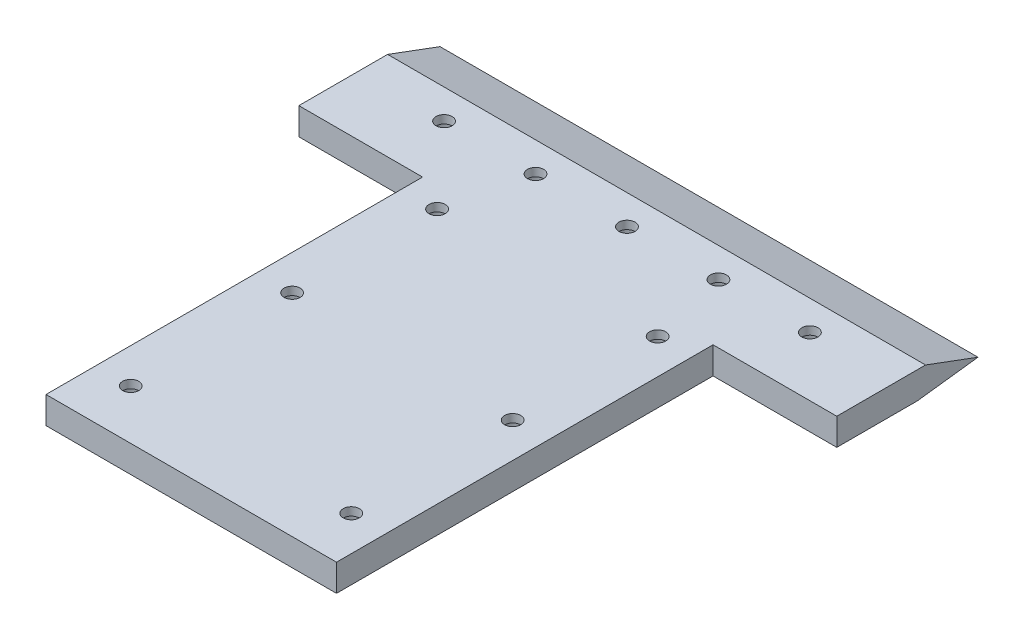
ISO-10303-21;
HEADER;
FILE_DESCRIPTION(('STEP AP214'),'2;1');
FILE_NAME('part.step','',(''),(''),'','','');
FILE_SCHEMA(('AUTOMOTIVE_DESIGN { 1 0 10303 214 1 1 1 1 }'));
ENDSEC;
DATA;
#1=APPLICATION_CONTEXT('core data for automotive mechanical design processes');
#2=APPLICATION_PROTOCOL_DEFINITION('international standard','automotive_design',2000,#1);
#3=PRODUCT_CONTEXT('',#1,'mechanical');
#4=PRODUCT('Part','Part','',(#3));
#5=PRODUCT_RELATED_PRODUCT_CATEGORY('part','',(#4));
#6=PRODUCT_DEFINITION_FORMATION('','',#4);
#7=PRODUCT_DEFINITION_CONTEXT('part definition',#1,'design');
#8=PRODUCT_DEFINITION('design','',#6,#7);
#9=PRODUCT_DEFINITION_SHAPE('','',#8);
#10=(LENGTH_UNIT() NAMED_UNIT(*) SI_UNIT(.MILLI.,.METRE.));
#11=(NAMED_UNIT(*) PLANE_ANGLE_UNIT() SI_UNIT($,.RADIAN.));
#12=(NAMED_UNIT(*) SI_UNIT($,.STERADIAN.) SOLID_ANGLE_UNIT());
#13=UNCERTAINTY_MEASURE_WITH_UNIT(LENGTH_MEASURE(1.E-05),#10,'distance_accuracy_value','');
#14=(GEOMETRIC_REPRESENTATION_CONTEXT(3) GLOBAL_UNCERTAINTY_ASSIGNED_CONTEXT((#13)) GLOBAL_UNIT_ASSIGNED_CONTEXT((#10,
#11,#12)) REPRESENTATION_CONTEXT('',''));
#15=CARTESIAN_POINT('',(0.,0.,0.));
#16=DIRECTION('',(0.,0.,1.));
#17=DIRECTION('',(1.,0.,0.));
#18=AXIS2_PLACEMENT_3D('',#15,#16,#17);
#19=CARTESIAN_POINT('',(24.3834765970557,10.,-66.2));
#20=DIRECTION('',(0.,-1.,0.));
#21=DIRECTION('',(0.,0.,-1.));
#22=AXIS2_PLACEMENT_3D('',#19,#20,#21);
#23=CYLINDRICAL_SURFACE('',#22,1.5);
#24=CARTESIAN_POINT('',(24.3834765970557,5.02,-66.2));
#25=DIRECTION('',(0.,-1.,0.));
#26=DIRECTION('',(0.,0.,-1.));
#27=AXIS2_PLACEMENT_3D('',#24,#25,#26);
#28=CIRCLE('',#27,1.5);
#29=CARTESIAN_POINT('',(24.3834765970557,5.02,-67.7));
#30=VERTEX_POINT('',#29);
#31=EDGE_CURVE('E195',#30,#30,#28,.T.);
#32=ORIENTED_EDGE('',*,*,#31,.F.);
#33=EDGE_LOOP('',(#32));
#34=FACE_BOUND('',#33,.T.);
#35=CARTESIAN_POINT('',(24.3834765970557,3.5,-66.2));
#36=DIRECTION('',(0.,-1.,0.));
#37=DIRECTION('',(0.,0.,-1.));
#38=AXIS2_PLACEMENT_3D('',#35,#36,#37);
#39=CIRCLE('',#38,1.5);
#40=CARTESIAN_POINT('',(24.3834765970557,3.5,-67.7));
#41=VERTEX_POINT('',#40);
#42=EDGE_CURVE('E39',#41,#41,#39,.F.);
#43=ORIENTED_EDGE('',*,*,#42,.F.);
#44=EDGE_LOOP('',(#43));
#45=FACE_BOUND('',#44,.T.);
#46=ADVANCED_FACE('F35',(#34,#45),#23,.F.);
#47=CARTESIAN_POINT('',(37.8834765970557,10.,-81.));
#48=DIRECTION('',(0.,-1.,0.));
#49=DIRECTION('',(0.,0.,-1.));
#50=AXIS2_PLACEMENT_3D('',#47,#48,#49);
#51=CYLINDRICAL_SURFACE('',#50,1.5);
#52=CARTESIAN_POINT('',(37.8834765970557,5.02,-81.));
#53=DIRECTION('',(0.,-1.,0.));
#54=DIRECTION('',(0.,0.,-1.));
#55=AXIS2_PLACEMENT_3D('',#52,#53,#54);
#56=CIRCLE('',#55,1.5);
#57=CARTESIAN_POINT('',(37.8834765970557,5.02,-82.5));
#58=VERTEX_POINT('',#57);
#59=EDGE_CURVE('E199',#58,#58,#56,.T.);
#60=ORIENTED_EDGE('',*,*,#59,.F.);
#61=EDGE_LOOP('',(#60));
#62=FACE_BOUND('',#61,.T.);
#63=CARTESIAN_POINT('',(37.8834765970557,3.5,-81.));
#64=DIRECTION('',(0.,-1.,0.));
#65=DIRECTION('',(0.,0.,-1.));
#66=AXIS2_PLACEMENT_3D('',#63,#64,#65);
#67=CIRCLE('',#66,1.5);
#68=CARTESIAN_POINT('',(37.8834765970557,3.5,-82.5));
#69=VERTEX_POINT('',#68);
#70=EDGE_CURVE('E190',#69,#69,#67,.F.);
#71=ORIENTED_EDGE('',*,*,#70,.F.);
#72=EDGE_LOOP('',(#71));
#73=FACE_BOUND('',#72,.T.);
#74=ADVANCED_FACE('F356',(#62,#73),#51,.F.);
#75=CARTESIAN_POINT('',(3.88347659705572,10.,-81.));
#76=DIRECTION('',(0.,-1.,0.));
#77=DIRECTION('',(0.,0.,-1.));
#78=AXIS2_PLACEMENT_3D('',#75,#76,#77);
#79=CYLINDRICAL_SURFACE('',#78,1.5);
#80=CARTESIAN_POINT('',(3.88347659705572,5.02,-81.));
#81=DIRECTION('',(0.,-1.,0.));
#82=DIRECTION('',(0.,0.,-1.));
#83=AXIS2_PLACEMENT_3D('',#80,#81,#82);
#84=CIRCLE('',#83,1.5);
#85=CARTESIAN_POINT('',(3.88347659705572,5.02,-82.5));
#86=VERTEX_POINT('',#85);
#87=EDGE_CURVE('E204',#86,#86,#84,.T.);
#88=ORIENTED_EDGE('',*,*,#87,.F.);
#89=EDGE_LOOP('',(#88));
#90=FACE_BOUND('',#89,.T.);
#91=CARTESIAN_POINT('',(3.88347659705572,3.5,-81.));
#92=DIRECTION('',(0.,-1.,0.));
#93=DIRECTION('',(0.,0.,-1.));
#94=AXIS2_PLACEMENT_3D('',#91,#92,#93);
#95=CIRCLE('',#94,1.5);
#96=CARTESIAN_POINT('',(3.88347659705572,3.5,-82.5));
#97=VERTEX_POINT('',#96);
#98=EDGE_CURVE('E188',#97,#97,#95,.F.);
#99=ORIENTED_EDGE('',*,*,#98,.F.);
#100=EDGE_LOOP('',(#99));
#101=FACE_BOUND('',#100,.T.);
#102=ADVANCED_FACE('F362',(#90,#101),#79,.F.);
#103=CARTESIAN_POINT('',(24.3834765970558,10.,-39.25));
#104=DIRECTION('',(0.,-1.,0.));
#105=DIRECTION('',(0.,0.,-1.));
#106=AXIS2_PLACEMENT_3D('',#103,#104,#105);
#107=CYLINDRICAL_SURFACE('',#106,1.50000000000001);
#108=CARTESIAN_POINT('',(24.3834765970558,5.02,-39.25));
#109=DIRECTION('',(0.,-1.,0.));
#110=DIRECTION('',(0.,0.,-1.));
#111=AXIS2_PLACEMENT_3D('',#108,#109,#110);
#112=CIRCLE('',#111,1.50000000000001);
#113=CARTESIAN_POINT('',(24.3834765970558,5.02,-40.75));
#114=VERTEX_POINT('',#113);
#115=EDGE_CURVE('E218',#114,#114,#112,.T.);
#116=ORIENTED_EDGE('',*,*,#115,.F.);
#117=EDGE_LOOP('',(#116));
#118=FACE_BOUND('',#117,.T.);
#119=CARTESIAN_POINT('',(24.3834765970558,3.5,-39.25));
#120=DIRECTION('',(0.,-1.,0.));
#121=DIRECTION('',(0.,0.,-1.));
#122=AXIS2_PLACEMENT_3D('',#119,#120,#121);
#123=CIRCLE('',#122,1.50000000000001);
#124=CARTESIAN_POINT('',(24.3834765970558,3.5,-40.75));
#125=VERTEX_POINT('',#124);
#126=EDGE_CURVE('E179',#125,#125,#123,.F.);
#127=ORIENTED_EDGE('',*,*,#126,.F.);
#128=EDGE_LOOP('',(#127));
#129=FACE_BOUND('',#128,.T.);
#130=ADVANCED_FACE('F368',(#118,#129),#107,.F.);
#131=CARTESIAN_POINT('',(20.8834765970557,10.,-81.));
#132=DIRECTION('',(0.,-1.,0.));
#133=DIRECTION('',(0.,0.,-1.));
#134=AXIS2_PLACEMENT_3D('',#131,#132,#133);
#135=CYLINDRICAL_SURFACE('',#134,1.5);
#136=CARTESIAN_POINT('',(20.8834765970557,5.02,-81.));
#137=DIRECTION('',(0.,-1.,0.));
#138=DIRECTION('',(0.,0.,-1.));
#139=AXIS2_PLACEMENT_3D('',#136,#137,#138);
#140=CIRCLE('',#139,1.5);
#141=CARTESIAN_POINT('',(20.8834765970557,5.02,-82.5));
#142=VERTEX_POINT('',#141);
#143=EDGE_CURVE('E224',#142,#142,#140,.T.);
#144=ORIENTED_EDGE('',*,*,#143,.F.);
#145=EDGE_LOOP('',(#144));
#146=FACE_BOUND('',#145,.T.);
#147=CARTESIAN_POINT('',(20.8834765970557,3.5,-81.));
#148=DIRECTION('',(0.,-1.,0.));
#149=DIRECTION('',(0.,0.,-1.));
#150=AXIS2_PLACEMENT_3D('',#147,#148,#149);
#151=CIRCLE('',#150,1.5);
#152=CARTESIAN_POINT('',(20.8834765970557,3.5,-82.5));
#153=VERTEX_POINT('',#152);
#154=EDGE_CURVE('E173',#153,#153,#151,.F.);
#155=ORIENTED_EDGE('',*,*,#154,.F.);
#156=EDGE_LOOP('',(#155));
#157=FACE_BOUND('',#156,.T.);
#158=ADVANCED_FACE('F458',(#146,#157),#135,.F.);
#159=CARTESIAN_POINT('',(24.3834765970557,10.,-9.25000000000001));
#160=DIRECTION('',(0.,-1.,0.));
#161=DIRECTION('',(0.,0.,-1.));
#162=AXIS2_PLACEMENT_3D('',#159,#160,#161);
#163=CYLINDRICAL_SURFACE('',#162,1.5);
#164=CARTESIAN_POINT('',(24.3834765970557,5.02,-9.25000000000001));
#165=DIRECTION('',(0.,-1.,0.));
#166=DIRECTION('',(0.,0.,-1.));
#167=AXIS2_PLACEMENT_3D('',#164,#165,#166);
#168=CIRCLE('',#167,1.5);
#169=CARTESIAN_POINT('',(24.3834765970557,5.02,-10.75));
#170=VERTEX_POINT('',#169);
#171=EDGE_CURVE('E233',#170,#170,#168,.T.);
#172=ORIENTED_EDGE('',*,*,#171,.F.);
#173=EDGE_LOOP('',(#172));
#174=FACE_BOUND('',#173,.T.);
#175=CARTESIAN_POINT('',(24.3834765970557,3.5,-9.25000000000001));
#176=DIRECTION('',(0.,-1.,0.));
#177=DIRECTION('',(0.,0.,-1.));
#178=AXIS2_PLACEMENT_3D('',#175,#176,#177);
#179=CIRCLE('',#178,1.5);
#180=CARTESIAN_POINT('',(24.3834765970557,3.5,-10.75));
#181=VERTEX_POINT('',#180);
#182=EDGE_CURVE('E163',#181,#181,#179,.F.);
#183=ORIENTED_EDGE('',*,*,#182,.F.);
#184=EDGE_LOOP('',(#183));
#185=FACE_BOUND('',#184,.T.);
#186=ADVANCED_FACE('F352',(#174,#185),#163,.F.);
#187=CARTESIAN_POINT('',(0.,5.02,0.));
#188=DIRECTION('',(0.,-1.,0.));
#189=DIRECTION('',(0.,0.,-1.));
#190=AXIS2_PLACEMENT_3D('',#187,#188,#189);
#191=PLANE('',#190);
#192=ORIENTED_EDGE('',*,*,#171,.T.);
#193=EDGE_LOOP('',(#192));
#194=FACE_BOUND('',#193,.T.);
#195=ORIENTED_EDGE('',*,*,#143,.T.);
#196=EDGE_LOOP('',(#195));
#197=FACE_BOUND('',#196,.T.);
#198=CARTESIAN_POINT('',(-16.6165234029443,5.02,-66.2));
#199=DIRECTION('',(0.,-1.,0.));
#200=DIRECTION('',(0.,0.,-1.));
#201=AXIS2_PLACEMENT_3D('',#198,#199,#200);
#202=CIRCLE('',#201,1.5);
#203=CARTESIAN_POINT('',(-16.6165234029443,5.02,-67.7));
#204=VERTEX_POINT('',#203);
#205=EDGE_CURVE('E221',#204,#204,#202,.T.);
#206=ORIENTED_EDGE('',*,*,#205,.T.);
#207=EDGE_LOOP('',(#206));
#208=FACE_BOUND('',#207,.T.);
#209=ORIENTED_EDGE('',*,*,#115,.T.);
#210=EDGE_LOOP('',(#209));
#211=FACE_BOUND('',#210,.T.);
#212=CARTESIAN_POINT('',(-16.6165234029443,5.02,-39.25));
#213=DIRECTION('',(0.,-1.,0.));
#214=DIRECTION('',(0.,0.,-1.));
#215=AXIS2_PLACEMENT_3D('',#212,#213,#214);
#216=CIRCLE('',#215,1.50000000000001);
#217=CARTESIAN_POINT('',(-16.6165234029443,5.02,-40.75));
#218=VERTEX_POINT('',#217);
#219=EDGE_CURVE('E215',#218,#218,#216,.T.);
#220=ORIENTED_EDGE('',*,*,#219,.T.);
#221=EDGE_LOOP('',(#220));
#222=FACE_BOUND('',#221,.T.);
#223=CARTESIAN_POINT('',(-16.6165234029443,5.02,-9.25000000000001));
#224=DIRECTION('',(0.,-1.,0.));
#225=DIRECTION('',(0.,0.,-1.));
#226=AXIS2_PLACEMENT_3D('',#223,#224,#225);
#227=CIRCLE('',#226,1.50000000000003);
#228=CARTESIAN_POINT('',(-16.6165234029443,5.02,-10.75));
#229=VERTEX_POINT('',#228);
#230=EDGE_CURVE('E212',#229,#229,#227,.T.);
#231=ORIENTED_EDGE('',*,*,#230,.T.);
#232=EDGE_LOOP('',(#231));
#233=FACE_BOUND('',#232,.T.);
#234=ORIENTED_EDGE('',*,*,#87,.T.);
#235=EDGE_LOOP('',(#234));
#236=FACE_BOUND('',#235,.T.);
#237=ORIENTED_EDGE('',*,*,#59,.T.);
#238=EDGE_LOOP('',(#237));
#239=FACE_BOUND('',#238,.T.);
#240=ORIENTED_EDGE('',*,*,#31,.T.);
#241=EDGE_LOOP('',(#240));
#242=FACE_BOUND('',#241,.T.);
#243=DIRECTION('',(0.,0.,1.));
#244=VECTOR('',#243,1.);
#245=CARTESIAN_POINT('',(53.8834765970557,5.02,-100.));
#246=LINE('',#245,#244);
#247=CARTESIAN_POINT('',(53.8834765970558,5.02,-86.5));
#248=VERTEX_POINT('',#247);
#249=CARTESIAN_POINT('',(53.8834765970557,5.02,-70.));
#250=VERTEX_POINT('',#249);
#251=EDGE_CURVE('E129',#248,#250,#246,.T.);
#252=ORIENTED_EDGE('',*,*,#251,.F.);
#253=DIRECTION('',(-1.,0.,0.));
#254=VECTOR('',#253,1.);
#255=CARTESIAN_POINT('',(53.8834765970558,5.02,-86.5));
#256=LINE('',#255,#254);
#257=CARTESIAN_POINT('',(-46.1165234029442,5.02,-86.5));
#258=VERTEX_POINT('',#257);
#259=EDGE_CURVE('E128',#248,#258,#256,.T.);
#260=ORIENTED_EDGE('',*,*,#259,.T.);
#261=DIRECTION('',(0.,0.,-1.));
#262=VECTOR('',#261,1.);
#263=CARTESIAN_POINT('',(-46.1165234029443,5.02,-70.));
#264=LINE('',#263,#262);
#265=CARTESIAN_POINT('',(-46.1165234029443,5.02,-70.));
#266=VERTEX_POINT('',#265);
#267=EDGE_CURVE('E111',#266,#258,#264,.T.);
#268=ORIENTED_EDGE('',*,*,#267,.F.);
#269=DIRECTION('',(-1.,0.,0.));
#270=VECTOR('',#269,1.);
#271=CARTESIAN_POINT('',(-23.1165234029443,5.02,-70.));
#272=LINE('',#271,#270);
#273=CARTESIAN_POINT('',(-23.1165234029443,5.02,-70.));
#274=VERTEX_POINT('',#273);
#275=EDGE_CURVE('E126',#274,#266,#272,.T.);
#276=ORIENTED_EDGE('',*,*,#275,.F.);
#277=DIRECTION('',(0.,0.,1.));
#278=VECTOR('',#277,1.);
#279=CARTESIAN_POINT('',(-23.1165234029443,5.02,-40.));
#280=LINE('',#279,#278);
#281=CARTESIAN_POINT('',(-23.1165234029443,5.02,0.));
#282=VERTEX_POINT('',#281);
#283=EDGE_CURVE('E133',#274,#282,#280,.T.);
#284=ORIENTED_EDGE('',*,*,#283,.T.);
#285=DIRECTION('',(-1.,0.,0.));
#286=VECTOR('',#285,1.);
#287=CARTESIAN_POINT('',(30.8834765970557,5.02,0.));
#288=LINE('',#287,#286);
#289=CARTESIAN_POINT('',(30.8834765970557,5.02,0.));
#290=VERTEX_POINT('',#289);
#291=EDGE_CURVE('E135',#290,#282,#288,.T.);
#292=ORIENTED_EDGE('',*,*,#291,.F.);
#293=DIRECTION('',(0.,0.,1.));
#294=VECTOR('',#293,1.);
#295=CARTESIAN_POINT('',(30.8834765970557,5.02,-40.));
#296=LINE('',#295,#294);
#297=CARTESIAN_POINT('',(30.8834765970557,5.02,-70.));
#298=VERTEX_POINT('',#297);
#299=EDGE_CURVE('E61',#298,#290,#296,.T.);
#300=ORIENTED_EDGE('',*,*,#299,.F.);
#301=DIRECTION('',(1.,0.,0.));
#302=VECTOR('',#301,1.);
#303=CARTESIAN_POINT('',(30.8834765970557,5.02,-70.));
#304=LINE('',#303,#302);
#305=EDGE_CURVE('E140',#298,#250,#304,.T.);
#306=ORIENTED_EDGE('',*,*,#305,.T.);
#307=EDGE_LOOP('',(#252,#260,#268,#276,#284,#292,#300,#306));
#308=FACE_BOUND('',#307,.T.);
#309=CARTESIAN_POINT('',(-13.1165234029443,5.02,-81.));
#310=DIRECTION('',(0.,-1.,0.));
#311=DIRECTION('',(0.,0.,-1.));
#312=AXIS2_PLACEMENT_3D('',#309,#310,#311);
#313=CIRCLE('',#312,1.5);
#314=CARTESIAN_POINT('',(-13.1165234029443,5.02,-82.5));
#315=VERTEX_POINT('',#314);
#316=EDGE_CURVE('E227',#315,#315,#313,.F.);
#317=ORIENTED_EDGE('',*,*,#316,.F.);
#318=EDGE_LOOP('',(#317));
#319=FACE_BOUND('',#318,.T.);
#320=CARTESIAN_POINT('',(-30.1165234029443,5.02,-81.));
#321=DIRECTION('',(0.,-1.,0.));
#322=DIRECTION('',(0.,0.,-1.));
#323=AXIS2_PLACEMENT_3D('',#320,#321,#322);
#324=CIRCLE('',#323,1.5);
#325=CARTESIAN_POINT('',(-30.1165234029443,5.02,-82.5));
#326=VERTEX_POINT('',#325);
#327=EDGE_CURVE('E230',#326,#326,#324,.F.);
#328=ORIENTED_EDGE('',*,*,#327,.F.);
#329=EDGE_LOOP('',(#328));
#330=FACE_BOUND('',#329,.T.);
#331=ADVANCED_FACE('F123',(#194,#197,#208,#211,#222,#233,#236,#239,#242,#308,#319,#330),#191,.F.);
#332=CARTESIAN_POINT('',(0.,0.,0.));
#333=DIRECTION('',(0.,-1.,0.));
#334=DIRECTION('',(0.,0.,-1.));
#335=AXIS2_PLACEMENT_3D('',#332,#333,#334);
#336=PLANE('',#335);
#337=DIRECTION('',(-1.,0.,0.));
#338=VECTOR('',#337,1.);
#339=CARTESIAN_POINT('',(53.8834765970558,0.,-85.));
#340=LINE('',#339,#338);
#341=CARTESIAN_POINT('',(53.8834765970558,0.,-85.));
#342=VERTEX_POINT('',#341);
#343=CARTESIAN_POINT('',(-46.1165234029442,0.,-85.));
#344=VERTEX_POINT('',#343);
#345=EDGE_CURVE('E272',#342,#344,#340,.T.);
#346=ORIENTED_EDGE('',*,*,#345,.F.);
#347=DIRECTION('',(0.,0.,1.));
#348=VECTOR('',#347,1.);
#349=CARTESIAN_POINT('',(53.8834765970557,0.,-100.));
#350=LINE('',#349,#348);
#351=CARTESIAN_POINT('',(53.8834765970557,0.,-70.));
#352=VERTEX_POINT('',#351);
#353=EDGE_CURVE('E150',#342,#352,#350,.T.);
#354=ORIENTED_EDGE('',*,*,#353,.T.);
#355=DIRECTION('',(1.,0.,0.));
#356=VECTOR('',#355,1.);
#357=CARTESIAN_POINT('',(30.8834765970557,0.,-70.));
#358=LINE('',#357,#356);
#359=CARTESIAN_POINT('',(30.8834765970557,0.,-70.));
#360=VERTEX_POINT('',#359);
#361=EDGE_CURVE('E152',#360,#352,#358,.T.);
#362=ORIENTED_EDGE('',*,*,#361,.F.);
#363=DIRECTION('',(0.,0.,-1.));
#364=VECTOR('',#363,1.);
#365=CARTESIAN_POINT('',(30.8834765970557,0.,-40.));
#366=LINE('',#365,#364);
#367=CARTESIAN_POINT('',(30.8834765970557,0.,0.));
#368=VERTEX_POINT('',#367);
#369=EDGE_CURVE('E89',#368,#360,#366,.T.);
#370=ORIENTED_EDGE('',*,*,#369,.F.);
#371=DIRECTION('',(1.,0.,0.));
#372=VECTOR('',#371,1.);
#373=CARTESIAN_POINT('',(-23.1165234029443,0.,0.));
#374=LINE('',#373,#372);
#375=CARTESIAN_POINT('',(-23.1165234029443,0.,0.));
#376=VERTEX_POINT('',#375);
#377=EDGE_CURVE('E142',#376,#368,#374,.T.);
#378=ORIENTED_EDGE('',*,*,#377,.F.);
#379=DIRECTION('',(0.,0.,-1.));
#380=VECTOR('',#379,1.);
#381=CARTESIAN_POINT('',(-23.1165234029443,0.,-40.));
#382=LINE('',#381,#380);
#383=CARTESIAN_POINT('',(-23.1165234029443,0.,-70.));
#384=VERTEX_POINT('',#383);
#385=EDGE_CURVE('E144',#376,#384,#382,.T.);
#386=ORIENTED_EDGE('',*,*,#385,.T.);
#387=DIRECTION('',(-1.,0.,0.));
#388=VECTOR('',#387,1.);
#389=CARTESIAN_POINT('',(-23.1165234029443,0.,-70.));
#390=LINE('',#389,#388);
#391=CARTESIAN_POINT('',(-46.1165234029443,0.,-70.));
#392=VERTEX_POINT('',#391);
#393=EDGE_CURVE('E147',#384,#392,#390,.T.);
#394=ORIENTED_EDGE('',*,*,#393,.T.);
#395=DIRECTION('',(0.,0.,-1.));
#396=VECTOR('',#395,1.);
#397=CARTESIAN_POINT('',(-46.1165234029443,0.,-70.));
#398=LINE('',#397,#396);
#399=EDGE_CURVE('E113',#392,#344,#398,.T.);
#400=ORIENTED_EDGE('',*,*,#399,.T.);
#401=EDGE_LOOP('',(#346,#354,#362,#370,#378,#386,#394,#400));
#402=FACE_BOUND('',#401,.T.);
#403=CARTESIAN_POINT('',(-16.6165234029442,0.,-66.2));
#404=DIRECTION('',(0.,-1.,0.));
#405=DIRECTION('',(0.,0.,1.));
#406=AXIS2_PLACEMENT_3D('',#403,#404,#405);
#407=CIRCLE('',#406,3.);
#408=CARTESIAN_POINT('',(-16.6165234029442,0.,-63.2));
#409=VERTEX_POINT('',#408);
#410=EDGE_CURVE('E307',#409,#409,#407,.T.);
#411=ORIENTED_EDGE('',*,*,#410,.F.);
#412=EDGE_LOOP('',(#411));
#413=FACE_BOUND('',#412,.T.);
#414=CARTESIAN_POINT('',(-16.6165234029443,0.,-39.25));
#415=DIRECTION('',(0.,-1.,0.));
#416=DIRECTION('',(0.,0.,1.));
#417=AXIS2_PLACEMENT_3D('',#414,#415,#416);
#418=CIRCLE('',#417,3.);
#419=CARTESIAN_POINT('',(-16.6165234029443,0.,-36.25));
#420=VERTEX_POINT('',#419);
#421=EDGE_CURVE('E294',#420,#420,#418,.T.);
#422=ORIENTED_EDGE('',*,*,#421,.F.);
#423=EDGE_LOOP('',(#422));
#424=FACE_BOUND('',#423,.T.);
#425=CARTESIAN_POINT('',(-16.6165234029443,0.,-9.25000000000001));
#426=DIRECTION('',(0.,-1.,0.));
#427=DIRECTION('',(0.,0.,1.));
#428=AXIS2_PLACEMENT_3D('',#425,#426,#427);
#429=CIRCLE('',#428,3.);
#430=CARTESIAN_POINT('',(-16.6165234029443,0.,-6.25000000000001));
#431=VERTEX_POINT('',#430);
#432=EDGE_CURVE('E295',#431,#431,#429,.T.);
#433=ORIENTED_EDGE('',*,*,#432,.F.);
#434=EDGE_LOOP('',(#433));
#435=FACE_BOUND('',#434,.T.);
#436=CARTESIAN_POINT('',(3.88347659705572,0.,-81.));
#437=DIRECTION('',(0.,-1.,0.));
#438=DIRECTION('',(0.,0.,-1.));
#439=AXIS2_PLACEMENT_3D('',#436,#437,#438);
#440=CIRCLE('',#439,3.);
#441=CARTESIAN_POINT('',(3.88347659705572,0.,-84.));
#442=VERTEX_POINT('',#441);
#443=EDGE_CURVE('E282',#442,#442,#440,.T.);
#444=ORIENTED_EDGE('',*,*,#443,.F.);
#445=EDGE_LOOP('',(#444));
#446=FACE_BOUND('',#445,.T.);
#447=CARTESIAN_POINT('',(-13.1165234029442,0.,-81.));
#448=DIRECTION('',(0.,-1.,0.));
#449=DIRECTION('',(0.,0.,1.));
#450=AXIS2_PLACEMENT_3D('',#447,#448,#449);
#451=CIRCLE('',#450,3.);
#452=CARTESIAN_POINT('',(-13.1165234029442,0.,-78.));
#453=VERTEX_POINT('',#452);
#454=EDGE_CURVE('E306',#453,#453,#451,.T.);
#455=ORIENTED_EDGE('',*,*,#454,.F.);
#456=EDGE_LOOP('',(#455));
#457=FACE_BOUND('',#456,.T.);
#458=CARTESIAN_POINT('',(-30.1165234029443,0.,-81.));
#459=DIRECTION('',(0.,-1.,0.));
#460=DIRECTION('',(0.,0.,1.));
#461=AXIS2_PLACEMENT_3D('',#458,#459,#460);
#462=CIRCLE('',#461,3.);
#463=CARTESIAN_POINT('',(-30.1165234029443,0.,-78.));
#464=VERTEX_POINT('',#463);
#465=EDGE_CURVE('E330',#464,#464,#462,.T.);
#466=ORIENTED_EDGE('',*,*,#465,.F.);
#467=EDGE_LOOP('',(#466));
#468=FACE_BOUND('',#467,.T.);
#469=CARTESIAN_POINT('',(24.3834765970557,0.,-66.2));
#470=DIRECTION('',(0.,-1.,0.));
#471=DIRECTION('',(0.,0.,-1.));
#472=AXIS2_PLACEMENT_3D('',#469,#470,#471);
#473=CIRCLE('',#472,3.);
#474=CARTESIAN_POINT('',(24.3834765970557,0.,-69.2));
#475=VERTEX_POINT('',#474);
#476=EDGE_CURVE('E324',#475,#475,#473,.T.);
#477=ORIENTED_EDGE('',*,*,#476,.F.);
#478=EDGE_LOOP('',(#477));
#479=FACE_BOUND('',#478,.T.);
#480=CARTESIAN_POINT('',(24.3834765970558,0.,-39.25));
#481=DIRECTION('',(0.,-1.,0.));
#482=DIRECTION('',(0.,0.,-1.));
#483=AXIS2_PLACEMENT_3D('',#480,#481,#482);
#484=CIRCLE('',#483,3.);
#485=CARTESIAN_POINT('',(24.3834765970558,0.,-42.25));
#486=VERTEX_POINT('',#485);
#487=EDGE_CURVE('E318',#486,#486,#484,.T.);
#488=ORIENTED_EDGE('',*,*,#487,.F.);
#489=EDGE_LOOP('',(#488));
#490=FACE_BOUND('',#489,.T.);
#491=CARTESIAN_POINT('',(20.8834765970557,0.,-81.));
#492=DIRECTION('',(0.,-1.,0.));
#493=DIRECTION('',(0.,0.,-1.));
#494=AXIS2_PLACEMENT_3D('',#491,#492,#493);
#495=CIRCLE('',#494,3.);
#496=CARTESIAN_POINT('',(20.8834765970557,0.,-84.));
#497=VERTEX_POINT('',#496);
#498=EDGE_CURVE('E283',#497,#497,#495,.T.);
#499=ORIENTED_EDGE('',*,*,#498,.F.);
#500=EDGE_LOOP('',(#499));
#501=FACE_BOUND('',#500,.T.);
#502=CARTESIAN_POINT('',(37.8834765970557,0.,-81.));
#503=DIRECTION('',(0.,-1.,0.));
#504=DIRECTION('',(0.,0.,-1.));
#505=AXIS2_PLACEMENT_3D('',#502,#503,#504);
#506=CIRCLE('',#505,3.);
#507=CARTESIAN_POINT('',(37.8834765970557,0.,-84.));
#508=VERTEX_POINT('',#507);
#509=EDGE_CURVE('E275',#508,#508,#506,.T.);
#510=ORIENTED_EDGE('',*,*,#509,.F.);
#511=EDGE_LOOP('',(#510));
#512=FACE_BOUND('',#511,.T.);
#513=CARTESIAN_POINT('',(24.3834765970557,0.,-9.25000000000001));
#514=DIRECTION('',(0.,-1.,0.));
#515=DIRECTION('',(0.,0.,-1.));
#516=AXIS2_PLACEMENT_3D('',#513,#514,#515);
#517=CIRCLE('',#516,3.);
#518=CARTESIAN_POINT('',(24.3834765970557,0.,-12.25));
#519=VERTEX_POINT('',#518);
#520=EDGE_CURVE('E207',#519,#519,#517,.T.);
#521=ORIENTED_EDGE('',*,*,#520,.F.);
#522=EDGE_LOOP('',(#521));
#523=FACE_BOUND('',#522,.T.);
#524=ADVANCED_FACE('F249',(#402,#413,#424,#435,#446,#457,#468,#479,#490,#501,#512,#523),#336,.T.);
#525=CARTESIAN_POINT('',(30.8834765970557,5.02,-40.));
#526=DIRECTION('',(-1.,0.,0.));
#527=DIRECTION('',(0.,0.,1.));
#528=AXIS2_PLACEMENT_3D('',#525,#526,#527);
#529=PLANE('',#528);
#530=ORIENTED_EDGE('',*,*,#369,.T.);
#531=DIRECTION('',(0.,-1.,0.));
#532=VECTOR('',#531,1.);
#533=CARTESIAN_POINT('',(30.8834765970557,5.02,-70.));
#534=LINE('',#533,#532);
#535=EDGE_CURVE('E11',#298,#360,#534,.T.);
#536=ORIENTED_EDGE('',*,*,#535,.F.);
#537=ORIENTED_EDGE('',*,*,#299,.T.);
#538=DIRECTION('',(0.,-1.,0.));
#539=VECTOR('',#538,1.);
#540=CARTESIAN_POINT('',(30.8834765970557,5.02,0.));
#541=LINE('',#540,#539);
#542=EDGE_CURVE('E95',#290,#368,#541,.T.);
#543=ORIENTED_EDGE('',*,*,#542,.T.);
#544=EDGE_LOOP('',(#530,#536,#537,#543));
#545=FACE_BOUND('',#544,.T.);
#546=ADVANCED_FACE('F252',(#545),#529,.F.);
#547=CARTESIAN_POINT('',(30.8834765970557,5.02,-70.));
#548=DIRECTION('',(0.,0.,-1.));
#549=DIRECTION('',(-1.,0.,0.));
#550=AXIS2_PLACEMENT_3D('',#547,#548,#549);
#551=PLANE('',#550);
#552=ORIENTED_EDGE('',*,*,#361,.T.);
#553=DIRECTION('',(0.,-1.,0.));
#554=VECTOR('',#553,1.);
#555=CARTESIAN_POINT('',(53.8834765970557,5.02,-70.));
#556=LINE('',#555,#554);
#557=EDGE_CURVE('E44',#250,#352,#556,.T.);
#558=ORIENTED_EDGE('',*,*,#557,.F.);
#559=ORIENTED_EDGE('',*,*,#305,.F.);
#560=ORIENTED_EDGE('',*,*,#535,.T.);
#561=EDGE_LOOP('',(#552,#558,#559,#560));
#562=FACE_BOUND('',#561,.T.);
#563=ADVANCED_FACE('F256',(#562),#551,.F.);
#564=CARTESIAN_POINT('',(53.8834765970557,5.02,-100.));
#565=DIRECTION('',(1.,0.,0.));
#566=DIRECTION('',(0.,0.,-1.));
#567=AXIS2_PLACEMENT_3D('',#564,#565,#566);
#568=PLANE('',#567);
#569=DIRECTION('',(0.,0.122974080544852,-0.992409882817653));
#570=VECTOR('',#569,1.);
#571=CARTESIAN_POINT('',(53.8834765970558,0.,-85.));
#572=LINE('',#571,#570);
#573=CARTESIAN_POINT('',(53.8834765970558,1.39414058503102,-96.250817151809));
#574=VERTEX_POINT('',#573);
#575=EDGE_CURVE('E264',#342,#574,#572,.T.);
#576=ORIENTED_EDGE('',*,*,#575,.T.);
#577=DIRECTION('',(0.,0.348535146257754,0.937295712047743));
#578=VECTOR('',#577,1.);
#579=CARTESIAN_POINT('',(53.8834765970558,0.,-100.));
#580=LINE('',#579,#578);
#581=EDGE_CURVE('E237',#574,#248,#580,.T.);
#582=ORIENTED_EDGE('',*,*,#581,.T.);
#583=ORIENTED_EDGE('',*,*,#251,.T.);
#584=ORIENTED_EDGE('',*,*,#557,.T.);
#585=ORIENTED_EDGE('',*,*,#353,.F.);
#586=EDGE_LOOP('',(#576,#582,#583,#584,#585));
#587=FACE_BOUND('',#586,.T.);
#588=ADVANCED_FACE('F259',(#587),#568,.T.);
#589=CARTESIAN_POINT('',(-46.1165234029443,5.02,-70.));
#590=DIRECTION('',(-1.,0.,0.));
#591=DIRECTION('',(0.,0.,1.));
#592=AXIS2_PLACEMENT_3D('',#589,#590,#591);
#593=PLANE('',#592);
#594=DIRECTION('',(0.,0.122974080544852,-0.992409882817653));
#595=VECTOR('',#594,1.);
#596=CARTESIAN_POINT('',(-46.1165234029442,0.,-85.));
#597=LINE('',#596,#595);
#598=CARTESIAN_POINT('',(-46.1165234029442,1.39414058503101,-96.250817151809));
#599=VERTEX_POINT('',#598);
#600=EDGE_CURVE('E52',#344,#599,#597,.T.);
#601=ORIENTED_EDGE('',*,*,#600,.F.);
#602=ORIENTED_EDGE('',*,*,#399,.F.);
#603=DIRECTION('',(0.,-1.,0.));
#604=VECTOR('',#603,1.);
#605=CARTESIAN_POINT('',(-46.1165234029443,5.02,-70.));
#606=LINE('',#605,#604);
#607=EDGE_CURVE('E107',#266,#392,#606,.T.);
#608=ORIENTED_EDGE('',*,*,#607,.F.);
#609=ORIENTED_EDGE('',*,*,#267,.T.);
#610=DIRECTION('',(0.,0.348535146257754,0.937295712047743));
#611=VECTOR('',#610,1.);
#612=CARTESIAN_POINT('',(-46.1165234029442,0.,-100.));
#613=LINE('',#612,#611);
#614=EDGE_CURVE('E236',#599,#258,#613,.T.);
#615=ORIENTED_EDGE('',*,*,#614,.F.);
#616=EDGE_LOOP('',(#601,#602,#608,#609,#615));
#617=FACE_BOUND('',#616,.T.);
#618=ADVANCED_FACE('F109',(#617),#593,.T.);
#619=CARTESIAN_POINT('',(-23.1165234029443,5.02,-70.));
#620=DIRECTION('',(0.,0.,1.));
#621=DIRECTION('',(1.,0.,0.));
#622=AXIS2_PLACEMENT_3D('',#619,#620,#621);
#623=PLANE('',#622);
#624=ORIENTED_EDGE('',*,*,#393,.F.);
#625=DIRECTION('',(0.,-1.,0.));
#626=VECTOR('',#625,1.);
#627=CARTESIAN_POINT('',(-23.1165234029443,5.02,-70.));
#628=LINE('',#627,#626);
#629=EDGE_CURVE('E118',#274,#384,#628,.T.);
#630=ORIENTED_EDGE('',*,*,#629,.F.);
#631=ORIENTED_EDGE('',*,*,#275,.T.);
#632=ORIENTED_EDGE('',*,*,#607,.T.);
#633=EDGE_LOOP('',(#624,#630,#631,#632));
#634=FACE_BOUND('',#633,.T.);
#635=ADVANCED_FACE('F132',(#634),#623,.T.);
#636=CARTESIAN_POINT('',(-23.1165234029443,5.02,-40.));
#637=DIRECTION('',(-1.,0.,0.));
#638=DIRECTION('',(0.,0.,1.));
#639=AXIS2_PLACEMENT_3D('',#636,#637,#638);
#640=PLANE('',#639);
#641=ORIENTED_EDGE('',*,*,#385,.F.);
#642=DIRECTION('',(0.,-1.,0.));
#643=VECTOR('',#642,1.);
#644=CARTESIAN_POINT('',(-23.1165234029443,5.02,0.));
#645=LINE('',#644,#643);
#646=EDGE_CURVE('E159',#282,#376,#645,.T.);
#647=ORIENTED_EDGE('',*,*,#646,.F.);
#648=ORIENTED_EDGE('',*,*,#283,.F.);
#649=ORIENTED_EDGE('',*,*,#629,.T.);
#650=EDGE_LOOP('',(#641,#647,#648,#649));
#651=FACE_BOUND('',#650,.T.);
#652=ADVANCED_FACE('F246',(#651),#640,.T.);
#653=CARTESIAN_POINT('',(-23.1165234029443,5.02,0.));
#654=DIRECTION('',(0.,0.,-1.));
#655=DIRECTION('',(-1.,0.,0.));
#656=AXIS2_PLACEMENT_3D('',#653,#654,#655);
#657=PLANE('',#656);
#658=ORIENTED_EDGE('',*,*,#377,.T.);
#659=ORIENTED_EDGE('',*,*,#542,.F.);
#660=ORIENTED_EDGE('',*,*,#291,.T.);
#661=ORIENTED_EDGE('',*,*,#646,.T.);
#662=EDGE_LOOP('',(#658,#659,#660,#661));
#663=FACE_BOUND('',#662,.T.);
#664=ADVANCED_FACE('F37',(#663),#657,.F.);
#665=CARTESIAN_POINT('',(53.8834765970558,0.,-100.));
#666=DIRECTION('',(0.,-0.937295712047743,0.348535146257754));
#667=DIRECTION('',(0.,-0.348535146257754,-0.937295712047743));
#668=AXIS2_PLACEMENT_3D('',#665,#666,#667);
#669=PLANE('',#668);
#670=ORIENTED_EDGE('',*,*,#581,.F.);
#671=DIRECTION('',(-1.,0.,0.));
#672=VECTOR('',#671,1.);
#673=CARTESIAN_POINT('',(53.8834765970558,1.39414058503102,-96.250817151809));
#674=LINE('',#673,#672);
#675=EDGE_CURVE('E267',#574,#599,#674,.T.);
#676=ORIENTED_EDGE('',*,*,#675,.T.);
#677=ORIENTED_EDGE('',*,*,#614,.T.);
#678=ORIENTED_EDGE('',*,*,#259,.F.);
#679=EDGE_LOOP('',(#670,#676,#677,#678));
#680=FACE_BOUND('',#679,.T.);
#681=ADVANCED_FACE('F266',(#680),#669,.F.);
#682=CARTESIAN_POINT('',(-16.6165234029443,10.,-9.25000000000001));
#683=DIRECTION('',(0.,-1.,0.));
#684=DIRECTION('',(0.,0.,-1.));
#685=AXIS2_PLACEMENT_3D('',#682,#683,#684);
#686=CYLINDRICAL_SURFACE('',#685,1.50000000000003);
#687=CARTESIAN_POINT('',(-16.6165234029443,3.5,-9.25000000000001));
#688=DIRECTION('',(0.,1.,0.));
#689=DIRECTION('',(0.,0.,1.));
#690=AXIS2_PLACEMENT_3D('',#687,#688,#689);
#691=CIRCLE('',#690,1.50000000000003);
#692=CARTESIAN_POINT('',(-16.6165234029443,3.5,-7.74999999999998));
#693=VERTEX_POINT('',#692);
#694=EDGE_CURVE('E185',#693,#693,#691,.F.);
#695=ORIENTED_EDGE('',*,*,#694,.T.);
#696=EDGE_LOOP('',(#695));
#697=FACE_BOUND('',#696,.T.);
#698=ORIENTED_EDGE('',*,*,#230,.F.);
#699=EDGE_LOOP('',(#698));
#700=FACE_BOUND('',#699,.T.);
#701=ADVANCED_FACE('F371',(#697,#700),#686,.F.);
#702=CARTESIAN_POINT('',(-16.6165234029443,10.,-39.25));
#703=DIRECTION('',(0.,-1.,0.));
#704=DIRECTION('',(0.,0.,-1.));
#705=AXIS2_PLACEMENT_3D('',#702,#703,#704);
#706=CYLINDRICAL_SURFACE('',#705,1.50000000000001);
#707=CARTESIAN_POINT('',(-16.6165234029443,3.5,-39.25));
#708=DIRECTION('',(0.,1.,0.));
#709=DIRECTION('',(0.,0.,1.));
#710=AXIS2_PLACEMENT_3D('',#707,#708,#709);
#711=CIRCLE('',#710,1.50000000000001);
#712=CARTESIAN_POINT('',(-16.6165234029443,3.5,-37.75));
#713=VERTEX_POINT('',#712);
#714=EDGE_CURVE('E182',#713,#713,#711,.F.);
#715=ORIENTED_EDGE('',*,*,#714,.T.);
#716=EDGE_LOOP('',(#715));
#717=FACE_BOUND('',#716,.T.);
#718=ORIENTED_EDGE('',*,*,#219,.F.);
#719=EDGE_LOOP('',(#718));
#720=FACE_BOUND('',#719,.T.);
#721=ADVANCED_FACE('F376',(#717,#720),#706,.F.);
#722=CARTESIAN_POINT('',(-16.6165234029443,10.,-66.2));
#723=DIRECTION('',(0.,-1.,0.));
#724=DIRECTION('',(0.,0.,-1.));
#725=AXIS2_PLACEMENT_3D('',#722,#723,#724);
#726=CYLINDRICAL_SURFACE('',#725,1.5);
#727=CARTESIAN_POINT('',(-16.6165234029443,3.5,-66.2));
#728=DIRECTION('',(0.,1.,0.));
#729=DIRECTION('',(0.,0.,1.));
#730=AXIS2_PLACEMENT_3D('',#727,#728,#729);
#731=CIRCLE('',#730,1.5);
#732=CARTESIAN_POINT('',(-16.6165234029443,3.5,-64.7));
#733=VERTEX_POINT('',#732);
#734=EDGE_CURVE('E176',#733,#733,#731,.F.);
#735=ORIENTED_EDGE('',*,*,#734,.T.);
#736=EDGE_LOOP('',(#735));
#737=FACE_BOUND('',#736,.T.);
#738=ORIENTED_EDGE('',*,*,#205,.F.);
#739=EDGE_LOOP('',(#738));
#740=FACE_BOUND('',#739,.T.);
#741=ADVANCED_FACE('F490',(#737,#740),#726,.F.);
#742=CARTESIAN_POINT('',(-13.1165234029443,10.,-81.));
#743=DIRECTION('',(0.,-1.,0.));
#744=DIRECTION('',(0.,0.,-1.));
#745=AXIS2_PLACEMENT_3D('',#742,#743,#744);
#746=CYLINDRICAL_SURFACE('',#745,1.5);
#747=CARTESIAN_POINT('',(-13.1165234029443,3.5,-81.));
#748=DIRECTION('',(0.,1.,0.));
#749=DIRECTION('',(0.,0.,1.));
#750=AXIS2_PLACEMENT_3D('',#747,#748,#749);
#751=CIRCLE('',#750,1.5);
#752=CARTESIAN_POINT('',(-13.1165234029443,3.5,-79.5));
#753=VERTEX_POINT('',#752);
#754=EDGE_CURVE('E170',#753,#753,#751,.T.);
#755=ORIENTED_EDGE('',*,*,#754,.F.);
#756=EDGE_LOOP('',(#755));
#757=FACE_BOUND('',#756,.T.);
#758=ORIENTED_EDGE('',*,*,#316,.T.);
#759=EDGE_LOOP('',(#758));
#760=FACE_BOUND('',#759,.T.);
#761=ADVANCED_FACE('F500',(#757,#760),#746,.F.);
#762=CARTESIAN_POINT('',(-30.1165234029443,10.,-81.));
#763=DIRECTION('',(0.,-1.,0.));
#764=DIRECTION('',(0.,0.,-1.));
#765=AXIS2_PLACEMENT_3D('',#762,#763,#764);
#766=CYLINDRICAL_SURFACE('',#765,1.5);
#767=CARTESIAN_POINT('',(-30.1165234029443,3.5,-81.));
#768=DIRECTION('',(0.,1.,0.));
#769=DIRECTION('',(0.,0.,1.));
#770=AXIS2_PLACEMENT_3D('',#767,#768,#769);
#771=CIRCLE('',#770,1.5);
#772=CARTESIAN_POINT('',(-30.1165234029443,3.5,-79.5));
#773=VERTEX_POINT('',#772);
#774=EDGE_CURVE('E166',#773,#773,#771,.T.);
#775=ORIENTED_EDGE('',*,*,#774,.F.);
#776=EDGE_LOOP('',(#775));
#777=FACE_BOUND('',#776,.T.);
#778=ORIENTED_EDGE('',*,*,#327,.T.);
#779=EDGE_LOOP('',(#778));
#780=FACE_BOUND('',#779,.T.);
#781=ADVANCED_FACE('F509',(#777,#780),#766,.F.);
#782=CARTESIAN_POINT('',(24.3834765970557,3.5,-9.25000000000001));
#783=DIRECTION('',(0.,-1.,0.));
#784=DIRECTION('',(0.,0.,-1.));
#785=AXIS2_PLACEMENT_3D('',#782,#783,#784);
#786=PLANE('',#785);
#787=CARTESIAN_POINT('',(24.3834765970557,3.5,-9.25000000000001));
#788=DIRECTION('',(0.,-1.,0.));
#789=DIRECTION('',(0.,0.,-1.));
#790=AXIS2_PLACEMENT_3D('',#787,#788,#789);
#791=CIRCLE('',#790,3.);
#792=CARTESIAN_POINT('',(24.3834765970557,3.5,-12.25));
#793=VERTEX_POINT('',#792);
#794=EDGE_CURVE('E167',#793,#793,#791,.T.);
#795=ORIENTED_EDGE('',*,*,#794,.T.);
#796=EDGE_LOOP('',(#795));
#797=FACE_BOUND('',#796,.T.);
#798=ORIENTED_EDGE('',*,*,#182,.T.);
#799=EDGE_LOOP('',(#798));
#800=FACE_BOUND('',#799,.T.);
#801=ADVANCED_FACE('F518',(#797,#800),#786,.T.);
#802=CARTESIAN_POINT('',(24.3834765970557,3.5,-9.25000000000001));
#803=DIRECTION('',(0.,-1.,0.));
#804=DIRECTION('',(0.,0.,-1.));
#805=AXIS2_PLACEMENT_3D('',#802,#803,#804);
#806=CYLINDRICAL_SURFACE('',#805,3.);
#807=ORIENTED_EDGE('',*,*,#794,.F.);
#808=EDGE_LOOP('',(#807));
#809=FACE_BOUND('',#808,.T.);
#810=ORIENTED_EDGE('',*,*,#520,.T.);
#811=EDGE_LOOP('',(#810));
#812=FACE_BOUND('',#811,.T.);
#813=ADVANCED_FACE('F343',(#809,#812),#806,.F.);
#814=CARTESIAN_POINT('',(-30.1165234029443,3.5,-81.));
#815=DIRECTION('',(0.,-1.,0.));
#816=DIRECTION('',(0.,0.,-1.));
#817=AXIS2_PLACEMENT_3D('',#814,#815,#816);
#818=CYLINDRICAL_SURFACE('',#817,3.);
#819=CARTESIAN_POINT('',(-30.1165234029443,3.5,-81.));
#820=DIRECTION('',(0.,-1.,0.));
#821=DIRECTION('',(0.,0.,1.));
#822=AXIS2_PLACEMENT_3D('',#819,#820,#821);
#823=CIRCLE('',#822,3.);
#824=CARTESIAN_POINT('',(-30.1165234029443,3.5,-78.));
#825=VERTEX_POINT('',#824);
#826=EDGE_CURVE('E327',#825,#825,#823,.T.);
#827=ORIENTED_EDGE('',*,*,#826,.F.);
#828=EDGE_LOOP('',(#827));
#829=FACE_BOUND('',#828,.T.);
#830=ORIENTED_EDGE('',*,*,#465,.T.);
#831=EDGE_LOOP('',(#830));
#832=FACE_BOUND('',#831,.T.);
#833=ADVANCED_FACE('F535',(#829,#832),#818,.F.);
#834=CARTESIAN_POINT('',(-30.1165234029443,3.5,-81.));
#835=DIRECTION('',(0.,1.,0.));
#836=DIRECTION('',(0.,0.,1.));
#837=AXIS2_PLACEMENT_3D('',#834,#835,#836);
#838=PLANE('',#837);
#839=ORIENTED_EDGE('',*,*,#774,.T.);
#840=EDGE_LOOP('',(#839));
#841=FACE_BOUND('',#840,.T.);
#842=ORIENTED_EDGE('',*,*,#826,.T.);
#843=EDGE_LOOP('',(#842));
#844=FACE_BOUND('',#843,.T.);
#845=ADVANCED_FACE('F545',(#841,#844),#838,.F.);
#846=CARTESIAN_POINT('',(-13.1165234029442,3.5,-81.));
#847=DIRECTION('',(0.,-1.,0.));
#848=DIRECTION('',(0.,0.,-1.));
#849=AXIS2_PLACEMENT_3D('',#846,#847,#848);
#850=CYLINDRICAL_SURFACE('',#849,3.);
#851=CARTESIAN_POINT('',(-13.1165234029442,3.5,-81.));
#852=DIRECTION('',(0.,-1.,0.));
#853=DIRECTION('',(0.,0.,1.));
#854=AXIS2_PLACEMENT_3D('',#851,#852,#853);
#855=CIRCLE('',#854,3.);
#856=CARTESIAN_POINT('',(-13.1165234029442,3.5,-78.));
#857=VERTEX_POINT('',#856);
#858=EDGE_CURVE('E333',#857,#857,#855,.T.);
#859=ORIENTED_EDGE('',*,*,#858,.F.);
#860=EDGE_LOOP('',(#859));
#861=FACE_BOUND('',#860,.T.);
#862=ORIENTED_EDGE('',*,*,#454,.T.);
#863=EDGE_LOOP('',(#862));
#864=FACE_BOUND('',#863,.T.);
#865=ADVANCED_FACE('F555',(#861,#864),#850,.F.);
#866=CARTESIAN_POINT('',(-13.1165234029442,3.5,-81.));
#867=DIRECTION('',(0.,1.,0.));
#868=DIRECTION('',(0.,0.,1.));
#869=AXIS2_PLACEMENT_3D('',#866,#867,#868);
#870=PLANE('',#869);
#871=ORIENTED_EDGE('',*,*,#754,.T.);
#872=EDGE_LOOP('',(#871));
#873=FACE_BOUND('',#872,.T.);
#874=ORIENTED_EDGE('',*,*,#858,.T.);
#875=EDGE_LOOP('',(#874));
#876=FACE_BOUND('',#875,.T.);
#877=ADVANCED_FACE('F565',(#873,#876),#870,.F.);
#878=CARTESIAN_POINT('',(20.8834765970557,3.5,-81.));
#879=DIRECTION('',(0.,-1.,0.));
#880=DIRECTION('',(0.,0.,-1.));
#881=AXIS2_PLACEMENT_3D('',#878,#879,#880);
#882=PLANE('',#881);
#883=CARTESIAN_POINT('',(20.8834765970557,3.5,-81.));
#884=DIRECTION('',(0.,-1.,0.));
#885=DIRECTION('',(0.,0.,-1.));
#886=AXIS2_PLACEMENT_3D('',#883,#884,#885);
#887=CIRCLE('',#886,3.);
#888=CARTESIAN_POINT('',(20.8834765970557,3.5,-84.));
#889=VERTEX_POINT('',#888);
#890=EDGE_CURVE('E279',#889,#889,#887,.T.);
#891=ORIENTED_EDGE('',*,*,#890,.T.);
#892=EDGE_LOOP('',(#891));
#893=FACE_BOUND('',#892,.T.);
#894=ORIENTED_EDGE('',*,*,#154,.T.);
#895=EDGE_LOOP('',(#894));
#896=FACE_BOUND('',#895,.T.);
#897=ADVANCED_FACE('F575',(#893,#896),#882,.T.);
#898=CARTESIAN_POINT('',(20.8834765970557,3.5,-81.));
#899=DIRECTION('',(0.,-1.,0.));
#900=DIRECTION('',(0.,0.,-1.));
#901=AXIS2_PLACEMENT_3D('',#898,#899,#900);
#902=CYLINDRICAL_SURFACE('',#901,3.);
#903=ORIENTED_EDGE('',*,*,#890,.F.);
#904=EDGE_LOOP('',(#903));
#905=FACE_BOUND('',#904,.T.);
#906=ORIENTED_EDGE('',*,*,#498,.T.);
#907=EDGE_LOOP('',(#906));
#908=FACE_BOUND('',#907,.T.);
#909=ADVANCED_FACE('F585',(#905,#908),#902,.F.);
#910=CARTESIAN_POINT('',(-16.6165234029442,3.5,-66.2));
#911=DIRECTION('',(0.,1.,0.));
#912=DIRECTION('',(0.,0.,1.));
#913=AXIS2_PLACEMENT_3D('',#910,#911,#912);
#914=PLANE('',#913);
#915=CARTESIAN_POINT('',(-16.6165234029442,3.5,-66.2));
#916=DIRECTION('',(0.,-1.,0.));
#917=DIRECTION('',(0.,0.,1.));
#918=AXIS2_PLACEMENT_3D('',#915,#916,#917);
#919=CIRCLE('',#918,3.);
#920=CARTESIAN_POINT('',(-16.6165234029442,3.5,-63.2));
#921=VERTEX_POINT('',#920);
#922=EDGE_CURVE('E303',#921,#921,#919,.T.);
#923=ORIENTED_EDGE('',*,*,#922,.T.);
#924=EDGE_LOOP('',(#923));
#925=FACE_BOUND('',#924,.T.);
#926=ORIENTED_EDGE('',*,*,#734,.F.);
#927=EDGE_LOOP('',(#926));
#928=FACE_BOUND('',#927,.T.);
#929=ADVANCED_FACE('F595',(#925,#928),#914,.F.);
#930=CARTESIAN_POINT('',(-16.6165234029442,3.5,-66.2));
#931=DIRECTION('',(0.,-1.,0.));
#932=DIRECTION('',(0.,0.,-1.));
#933=AXIS2_PLACEMENT_3D('',#930,#931,#932);
#934=CYLINDRICAL_SURFACE('',#933,3.);
#935=ORIENTED_EDGE('',*,*,#922,.F.);
#936=EDGE_LOOP('',(#935));
#937=FACE_BOUND('',#936,.T.);
#938=ORIENTED_EDGE('',*,*,#410,.T.);
#939=EDGE_LOOP('',(#938));
#940=FACE_BOUND('',#939,.T.);
#941=ADVANCED_FACE('F605',(#937,#940),#934,.F.);
#942=CARTESIAN_POINT('',(24.3834765970558,3.5,-39.25));
#943=DIRECTION('',(0.,-1.,0.));
#944=DIRECTION('',(0.,0.,-1.));
#945=AXIS2_PLACEMENT_3D('',#942,#943,#944);
#946=PLANE('',#945);
#947=CARTESIAN_POINT('',(24.3834765970558,3.5,-39.25));
#948=DIRECTION('',(0.,-1.,0.));
#949=DIRECTION('',(0.,0.,-1.));
#950=AXIS2_PLACEMENT_3D('',#947,#948,#949);
#951=CIRCLE('',#950,3.);
#952=CARTESIAN_POINT('',(24.3834765970558,3.5,-42.25));
#953=VERTEX_POINT('',#952);
#954=EDGE_CURVE('E315',#953,#953,#951,.T.);
#955=ORIENTED_EDGE('',*,*,#954,.T.);
#956=EDGE_LOOP('',(#955));
#957=FACE_BOUND('',#956,.T.);
#958=ORIENTED_EDGE('',*,*,#126,.T.);
#959=EDGE_LOOP('',(#958));
#960=FACE_BOUND('',#959,.T.);
#961=ADVANCED_FACE('F615',(#957,#960),#946,.T.);
#962=CARTESIAN_POINT('',(24.3834765970558,3.5,-39.25));
#963=DIRECTION('',(0.,-1.,0.));
#964=DIRECTION('',(0.,0.,-1.));
#965=AXIS2_PLACEMENT_3D('',#962,#963,#964);
#966=CYLINDRICAL_SURFACE('',#965,3.);
#967=ORIENTED_EDGE('',*,*,#954,.F.);
#968=EDGE_LOOP('',(#967));
#969=FACE_BOUND('',#968,.T.);
#970=ORIENTED_EDGE('',*,*,#487,.T.);
#971=EDGE_LOOP('',(#970));
#972=FACE_BOUND('',#971,.T.);
#973=ADVANCED_FACE('F625',(#969,#972),#966,.F.);
#974=CARTESIAN_POINT('',(-16.6165234029443,3.5,-39.25));
#975=DIRECTION('',(0.,1.,0.));
#976=DIRECTION('',(0.,0.,1.));
#977=AXIS2_PLACEMENT_3D('',#974,#975,#976);
#978=PLANE('',#977);
#979=CARTESIAN_POINT('',(-16.6165234029443,3.5,-39.25));
#980=DIRECTION('',(0.,-1.,0.));
#981=DIRECTION('',(0.,0.,1.));
#982=AXIS2_PLACEMENT_3D('',#979,#980,#981);
#983=CIRCLE('',#982,3.);
#984=CARTESIAN_POINT('',(-16.6165234029443,3.5,-36.25));
#985=VERTEX_POINT('',#984);
#986=EDGE_CURVE('E310',#985,#985,#983,.T.);
#987=ORIENTED_EDGE('',*,*,#986,.T.);
#988=EDGE_LOOP('',(#987));
#989=FACE_BOUND('',#988,.T.);
#990=ORIENTED_EDGE('',*,*,#714,.F.);
#991=EDGE_LOOP('',(#990));
#992=FACE_BOUND('',#991,.T.);
#993=ADVANCED_FACE('F635',(#989,#992),#978,.F.);
#994=CARTESIAN_POINT('',(-16.6165234029443,3.5,-39.25));
#995=DIRECTION('',(0.,-1.,0.));
#996=DIRECTION('',(0.,0.,-1.));
#997=AXIS2_PLACEMENT_3D('',#994,#995,#996);
#998=CYLINDRICAL_SURFACE('',#997,3.);
#999=ORIENTED_EDGE('',*,*,#986,.F.);
#1000=EDGE_LOOP('',(#999));
#1001=FACE_BOUND('',#1000,.T.);
#1002=ORIENTED_EDGE('',*,*,#421,.T.);
#1003=EDGE_LOOP('',(#1002));
#1004=FACE_BOUND('',#1003,.T.);
#1005=ADVANCED_FACE('F645',(#1001,#1004),#998,.F.);
#1006=CARTESIAN_POINT('',(-16.6165234029443,3.5,-9.25000000000001));
#1007=DIRECTION('',(0.,1.,0.));
#1008=DIRECTION('',(0.,0.,1.));
#1009=AXIS2_PLACEMENT_3D('',#1006,#1007,#1008);
#1010=PLANE('',#1009);
#1011=CARTESIAN_POINT('',(-16.6165234029443,3.5,-9.25000000000001));
#1012=DIRECTION('',(0.,-1.,0.));
#1013=DIRECTION('',(0.,0.,1.));
#1014=AXIS2_PLACEMENT_3D('',#1011,#1012,#1013);
#1015=CIRCLE('',#1014,3.);
#1016=CARTESIAN_POINT('',(-16.6165234029443,3.5,-6.25000000000001));
#1017=VERTEX_POINT('',#1016);
#1018=EDGE_CURVE('E291',#1017,#1017,#1015,.T.);
#1019=ORIENTED_EDGE('',*,*,#1018,.T.);
#1020=EDGE_LOOP('',(#1019));
#1021=FACE_BOUND('',#1020,.T.);
#1022=ORIENTED_EDGE('',*,*,#694,.F.);
#1023=EDGE_LOOP('',(#1022));
#1024=FACE_BOUND('',#1023,.T.);
#1025=ADVANCED_FACE('F655',(#1021,#1024),#1010,.F.);
#1026=CARTESIAN_POINT('',(-16.6165234029443,3.5,-9.25000000000001));
#1027=DIRECTION('',(0.,-1.,0.));
#1028=DIRECTION('',(0.,0.,-1.));
#1029=AXIS2_PLACEMENT_3D('',#1026,#1027,#1028);
#1030=CYLINDRICAL_SURFACE('',#1029,3.);
#1031=ORIENTED_EDGE('',*,*,#1018,.F.);
#1032=EDGE_LOOP('',(#1031));
#1033=FACE_BOUND('',#1032,.T.);
#1034=ORIENTED_EDGE('',*,*,#432,.T.);
#1035=EDGE_LOOP('',(#1034));
#1036=FACE_BOUND('',#1035,.T.);
#1037=ADVANCED_FACE('F665',(#1033,#1036),#1030,.F.);
#1038=CARTESIAN_POINT('',(3.88347659705572,3.5,-81.));
#1039=DIRECTION('',(0.,-1.,0.));
#1040=DIRECTION('',(0.,0.,-1.));
#1041=AXIS2_PLACEMENT_3D('',#1038,#1039,#1040);
#1042=PLANE('',#1041);
#1043=CARTESIAN_POINT('',(3.88347659705572,3.5,-81.));
#1044=DIRECTION('',(0.,-1.,0.));
#1045=DIRECTION('',(0.,0.,-1.));
#1046=AXIS2_PLACEMENT_3D('',#1043,#1044,#1045);
#1047=CIRCLE('',#1046,3.);
#1048=CARTESIAN_POINT('',(3.88347659705572,3.5,-84.));
#1049=VERTEX_POINT('',#1048);
#1050=EDGE_CURVE('E298',#1049,#1049,#1047,.T.);
#1051=ORIENTED_EDGE('',*,*,#1050,.T.);
#1052=EDGE_LOOP('',(#1051));
#1053=FACE_BOUND('',#1052,.T.);
#1054=ORIENTED_EDGE('',*,*,#98,.T.);
#1055=EDGE_LOOP('',(#1054));
#1056=FACE_BOUND('',#1055,.T.);
#1057=ADVANCED_FACE('F675',(#1053,#1056),#1042,.T.);
#1058=CARTESIAN_POINT('',(3.88347659705572,3.5,-81.));
#1059=DIRECTION('',(0.,-1.,0.));
#1060=DIRECTION('',(0.,0.,-1.));
#1061=AXIS2_PLACEMENT_3D('',#1058,#1059,#1060);
#1062=CYLINDRICAL_SURFACE('',#1061,3.);
#1063=ORIENTED_EDGE('',*,*,#1050,.F.);
#1064=EDGE_LOOP('',(#1063));
#1065=FACE_BOUND('',#1064,.T.);
#1066=ORIENTED_EDGE('',*,*,#443,.T.);
#1067=EDGE_LOOP('',(#1066));
#1068=FACE_BOUND('',#1067,.T.);
#1069=ADVANCED_FACE('F685',(#1065,#1068),#1062,.F.);
#1070=CARTESIAN_POINT('',(37.8834765970557,3.5,-81.));
#1071=DIRECTION('',(0.,-1.,0.));
#1072=DIRECTION('',(0.,0.,-1.));
#1073=AXIS2_PLACEMENT_3D('',#1070,#1071,#1072);
#1074=PLANE('',#1073);
#1075=CARTESIAN_POINT('',(37.8834765970557,3.5,-81.));
#1076=DIRECTION('',(0.,-1.,0.));
#1077=DIRECTION('',(0.,0.,-1.));
#1078=AXIS2_PLACEMENT_3D('',#1075,#1076,#1077);
#1079=CIRCLE('',#1078,3.);
#1080=CARTESIAN_POINT('',(37.8834765970557,3.5,-84.));
#1081=VERTEX_POINT('',#1080);
#1082=EDGE_CURVE('E286',#1081,#1081,#1079,.T.);
#1083=ORIENTED_EDGE('',*,*,#1082,.T.);
#1084=EDGE_LOOP('',(#1083));
#1085=FACE_BOUND('',#1084,.T.);
#1086=ORIENTED_EDGE('',*,*,#70,.T.);
#1087=EDGE_LOOP('',(#1086));
#1088=FACE_BOUND('',#1087,.T.);
#1089=ADVANCED_FACE('F695',(#1085,#1088),#1074,.T.);
#1090=CARTESIAN_POINT('',(37.8834765970557,3.5,-81.));
#1091=DIRECTION('',(0.,-1.,0.));
#1092=DIRECTION('',(0.,0.,-1.));
#1093=AXIS2_PLACEMENT_3D('',#1090,#1091,#1092);
#1094=CYLINDRICAL_SURFACE('',#1093,3.);
#1095=ORIENTED_EDGE('',*,*,#1082,.F.);
#1096=EDGE_LOOP('',(#1095));
#1097=FACE_BOUND('',#1096,.T.);
#1098=ORIENTED_EDGE('',*,*,#509,.T.);
#1099=EDGE_LOOP('',(#1098));
#1100=FACE_BOUND('',#1099,.T.);
#1101=ADVANCED_FACE('F705',(#1097,#1100),#1094,.F.);
#1102=CARTESIAN_POINT('',(24.3834765970557,3.5,-66.2));
#1103=DIRECTION('',(0.,-1.,0.));
#1104=DIRECTION('',(0.,0.,-1.));
#1105=AXIS2_PLACEMENT_3D('',#1102,#1103,#1104);
#1106=PLANE('',#1105);
#1107=CARTESIAN_POINT('',(24.3834765970557,3.5,-66.2));
#1108=DIRECTION('',(0.,-1.,0.));
#1109=DIRECTION('',(0.,0.,-1.));
#1110=AXIS2_PLACEMENT_3D('',#1107,#1108,#1109);
#1111=CIRCLE('',#1110,3.);
#1112=CARTESIAN_POINT('',(24.3834765970557,3.5,-69.2));
#1113=VERTEX_POINT('',#1112);
#1114=EDGE_CURVE('E321',#1113,#1113,#1111,.T.);
#1115=ORIENTED_EDGE('',*,*,#1114,.T.);
#1116=EDGE_LOOP('',(#1115));
#1117=FACE_BOUND('',#1116,.T.);
#1118=ORIENTED_EDGE('',*,*,#42,.T.);
#1119=EDGE_LOOP('',(#1118));
#1120=FACE_BOUND('',#1119,.T.);
#1121=ADVANCED_FACE('F715',(#1117,#1120),#1106,.T.);
#1122=CARTESIAN_POINT('',(24.3834765970557,3.5,-66.2));
#1123=DIRECTION('',(0.,-1.,0.));
#1124=DIRECTION('',(0.,0.,-1.));
#1125=AXIS2_PLACEMENT_3D('',#1122,#1123,#1124);
#1126=CYLINDRICAL_SURFACE('',#1125,3.);
#1127=ORIENTED_EDGE('',*,*,#1114,.F.);
#1128=EDGE_LOOP('',(#1127));
#1129=FACE_BOUND('',#1128,.T.);
#1130=ORIENTED_EDGE('',*,*,#476,.T.);
#1131=EDGE_LOOP('',(#1130));
#1132=FACE_BOUND('',#1131,.T.);
#1133=ADVANCED_FACE('F725',(#1129,#1132),#1126,.F.);
#1134=CARTESIAN_POINT('',(53.8834765970558,0.,-85.));
#1135=DIRECTION('',(0.,0.992409882817653,0.122974080544852));
#1136=DIRECTION('',(0.,-0.122974080544852,0.992409882817653));
#1137=AXIS2_PLACEMENT_3D('',#1134,#1135,#1136);
#1138=PLANE('',#1137);
#1139=ORIENTED_EDGE('',*,*,#600,.T.);
#1140=ORIENTED_EDGE('',*,*,#675,.F.);
#1141=ORIENTED_EDGE('',*,*,#575,.F.);
#1142=ORIENTED_EDGE('',*,*,#345,.T.);
#1143=EDGE_LOOP('',(#1139,#1140,#1141,#1142));
#1144=FACE_BOUND('',#1143,.T.);
#1145=ADVANCED_FACE('F734',(#1144),#1138,.F.);
#1146=CLOSED_SHELL('',(#46,#74,#102,#130,#158,#186,#331,#524,#546,#563,#588,#618,#635,#652,#664,
#681,#701,#721,#741,#761,#781,#801,#813,#833,#845,#865,#877,#897,#909,#929,#941,#961,#973,#993,
#1005,#1025,#1037,#1057,#1069,#1089,#1101,#1121,#1133,#1145));
#1147=MANIFOLD_SOLID_BREP('B2',#1146);
#1148=ADVANCED_BREP_SHAPE_REPRESENTATION('',(#18,#1147),#14);
#1149=SHAPE_DEFINITION_REPRESENTATION(#9,#1148);
ENDSEC;
END-ISO-10303-21;
